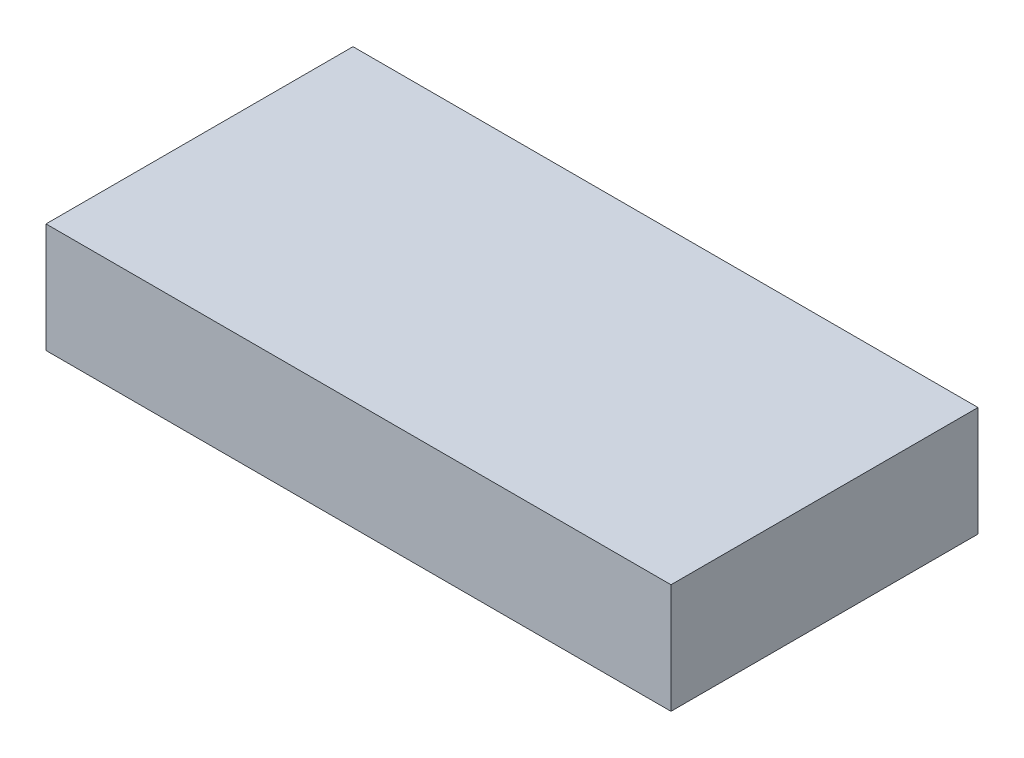
ISO-10303-21;
HEADER;
FILE_DESCRIPTION(('STEP AP214'),'2;1');
FILE_NAME('part.step','',(''),(''),'','','');
FILE_SCHEMA(('AUTOMOTIVE_DESIGN { 1 0 10303 214 1 1 1 1 }'));
ENDSEC;
DATA;
#1=APPLICATION_CONTEXT('core data for automotive mechanical design processes');
#2=APPLICATION_PROTOCOL_DEFINITION('international standard','automotive_design',2000,#1);
#3=PRODUCT_CONTEXT('',#1,'mechanical');
#4=PRODUCT('Part','Part','',(#3));
#5=PRODUCT_RELATED_PRODUCT_CATEGORY('part','',(#4));
#6=PRODUCT_DEFINITION_FORMATION('','',#4);
#7=PRODUCT_DEFINITION_CONTEXT('part definition',#1,'design');
#8=PRODUCT_DEFINITION('design','',#6,#7);
#9=PRODUCT_DEFINITION_SHAPE('','',#8);
#10=(LENGTH_UNIT() NAMED_UNIT(*) SI_UNIT(.MILLI.,.METRE.));
#11=(NAMED_UNIT(*) PLANE_ANGLE_UNIT() SI_UNIT($,.RADIAN.));
#12=(NAMED_UNIT(*) SI_UNIT($,.STERADIAN.) SOLID_ANGLE_UNIT());
#13=UNCERTAINTY_MEASURE_WITH_UNIT(LENGTH_MEASURE(1.E-05),#10,'distance_accuracy_value','');
#14=(GEOMETRIC_REPRESENTATION_CONTEXT(3) GLOBAL_UNCERTAINTY_ASSIGNED_CONTEXT((#13)) GLOBAL_UNIT_ASSIGNED_CONTEXT((#10,
#11,#12)) REPRESENTATION_CONTEXT('',''));
#15=CARTESIAN_POINT('',(0.,0.,0.));
#16=DIRECTION('',(0.,0.,1.));
#17=DIRECTION('',(1.,0.,0.));
#18=AXIS2_PLACEMENT_3D('',#15,#16,#17);
#19=CARTESIAN_POINT('',(28.5,10.,-14.));
#20=DIRECTION('',(-1.,0.,0.));
#21=DIRECTION('',(0.,0.,1.));
#22=AXIS2_PLACEMENT_3D('',#19,#20,#21);
#23=PLANE('',#22);
#24=DIRECTION('',(0.,0.,-1.));
#25=VECTOR('',#24,1.);
#26=CARTESIAN_POINT('',(28.5,0.,-14.));
#27=LINE('',#26,#25);
#28=CARTESIAN_POINT('',(28.5,0.,14.));
#29=VERTEX_POINT('',#28);
#30=CARTESIAN_POINT('',(28.5,0.,-14.));
#31=VERTEX_POINT('',#30);
#32=EDGE_CURVE('E98',#29,#31,#27,.T.);
#33=ORIENTED_EDGE('',*,*,#32,.T.);
#34=DIRECTION('',(0.,-1.,0.));
#35=VECTOR('',#34,1.);
#36=CARTESIAN_POINT('',(28.5,10.,-14.));
#37=LINE('',#36,#35);
#38=CARTESIAN_POINT('',(28.5,10.,-14.));
#39=VERTEX_POINT('',#38);
#40=EDGE_CURVE('E11',#39,#31,#37,.T.);
#41=ORIENTED_EDGE('',*,*,#40,.F.);
#42=DIRECTION('',(0.,0.,-1.));
#43=VECTOR('',#42,1.);
#44=CARTESIAN_POINT('',(28.5,10.,-14.));
#45=LINE('',#44,#43);
#46=CARTESIAN_POINT('',(28.5,10.,14.));
#47=VERTEX_POINT('',#46);
#48=EDGE_CURVE('E86',#47,#39,#45,.T.);
#49=ORIENTED_EDGE('',*,*,#48,.F.);
#50=DIRECTION('',(0.,-1.,0.));
#51=VECTOR('',#50,1.);
#52=CARTESIAN_POINT('',(28.5,10.,14.));
#53=LINE('',#52,#51);
#54=EDGE_CURVE('E94',#47,#29,#53,.T.);
#55=ORIENTED_EDGE('',*,*,#54,.T.);
#56=EDGE_LOOP('',(#33,#41,#49,#55));
#57=FACE_BOUND('',#56,.T.);
#58=ADVANCED_FACE('F35',(#57),#23,.F.);
#59=CARTESIAN_POINT('',(-28.5,10.,-14.));
#60=DIRECTION('',(0.,0.,1.));
#61=DIRECTION('',(1.,0.,0.));
#62=AXIS2_PLACEMENT_3D('',#59,#60,#61);
#63=PLANE('',#62);
#64=DIRECTION('',(-1.,0.,0.));
#65=VECTOR('',#64,1.);
#66=CARTESIAN_POINT('',(-28.5,0.,-14.));
#67=LINE('',#66,#65);
#68=CARTESIAN_POINT('',(-28.5,0.,-14.));
#69=VERTEX_POINT('',#68);
#70=EDGE_CURVE('E90',#31,#69,#67,.T.);
#71=ORIENTED_EDGE('',*,*,#70,.T.);
#72=DIRECTION('',(0.,-1.,0.));
#73=VECTOR('',#72,1.);
#74=CARTESIAN_POINT('',(-28.5,10.,-14.));
#75=LINE('',#74,#73);
#76=CARTESIAN_POINT('',(-28.5,10.,-14.));
#77=VERTEX_POINT('',#76);
#78=EDGE_CURVE('E43',#77,#69,#75,.T.);
#79=ORIENTED_EDGE('',*,*,#78,.F.);
#80=DIRECTION('',(-1.,0.,0.));
#81=VECTOR('',#80,1.);
#82=CARTESIAN_POINT('',(-28.5,10.,-14.));
#83=LINE('',#82,#81);
#84=EDGE_CURVE('E81',#39,#77,#83,.T.);
#85=ORIENTED_EDGE('',*,*,#84,.F.);
#86=ORIENTED_EDGE('',*,*,#40,.T.);
#87=EDGE_LOOP('',(#71,#79,#85,#86));
#88=FACE_BOUND('',#87,.T.);
#89=ADVANCED_FACE('F89',(#88),#63,.F.);
#90=CARTESIAN_POINT('',(-28.5,10.,-14.));
#91=DIRECTION('',(1.,0.,0.));
#92=DIRECTION('',(0.,0.,-1.));
#93=AXIS2_PLACEMENT_3D('',#90,#91,#92);
#94=PLANE('',#93);
#95=DIRECTION('',(0.,0.,1.));
#96=VECTOR('',#95,1.);
#97=CARTESIAN_POINT('',(-28.5,0.,-14.));
#98=LINE('',#97,#96);
#99=CARTESIAN_POINT('',(-28.5,0.,14.));
#100=VERTEX_POINT('',#99);
#101=EDGE_CURVE('E68',#69,#100,#98,.T.);
#102=ORIENTED_EDGE('',*,*,#101,.T.);
#103=DIRECTION('',(0.,-1.,0.));
#104=VECTOR('',#103,1.);
#105=CARTESIAN_POINT('',(-28.5,10.,14.));
#106=LINE('',#105,#104);
#107=CARTESIAN_POINT('',(-28.5,10.,14.));
#108=VERTEX_POINT('',#107);
#109=EDGE_CURVE('E91',#108,#100,#106,.T.);
#110=ORIENTED_EDGE('',*,*,#109,.F.);
#111=DIRECTION('',(0.,0.,1.));
#112=VECTOR('',#111,1.);
#113=CARTESIAN_POINT('',(-28.5,10.,-14.));
#114=LINE('',#113,#112);
#115=EDGE_CURVE('E84',#77,#108,#114,.T.);
#116=ORIENTED_EDGE('',*,*,#115,.F.);
#117=ORIENTED_EDGE('',*,*,#78,.T.);
#118=EDGE_LOOP('',(#102,#110,#116,#117));
#119=FACE_BOUND('',#118,.T.);
#120=ADVANCED_FACE('F92',(#119),#94,.F.);
#121=CARTESIAN_POINT('',(-28.5,10.,14.));
#122=DIRECTION('',(0.,0.,-1.));
#123=DIRECTION('',(-1.,0.,0.));
#124=AXIS2_PLACEMENT_3D('',#121,#122,#123);
#125=PLANE('',#124);
#126=DIRECTION('',(1.,0.,0.));
#127=VECTOR('',#126,1.);
#128=CARTESIAN_POINT('',(-28.5,0.,14.));
#129=LINE('',#128,#127);
#130=EDGE_CURVE('E74',#100,#29,#129,.T.);
#131=ORIENTED_EDGE('',*,*,#130,.T.);
#132=ORIENTED_EDGE('',*,*,#54,.F.);
#133=DIRECTION('',(1.,0.,0.));
#134=VECTOR('',#133,1.);
#135=CARTESIAN_POINT('',(-28.5,10.,14.));
#136=LINE('',#135,#134);
#137=EDGE_CURVE('E51',#108,#47,#136,.T.);
#138=ORIENTED_EDGE('',*,*,#137,.F.);
#139=ORIENTED_EDGE('',*,*,#109,.T.);
#140=EDGE_LOOP('',(#131,#132,#138,#139));
#141=FACE_BOUND('',#140,.T.);
#142=ADVANCED_FACE('F105',(#141),#125,.F.);
#143=CARTESIAN_POINT('',(0.,10.,0.));
#144=DIRECTION('',(0.,1.,0.));
#145=DIRECTION('',(0.,0.,1.));
#146=AXIS2_PLACEMENT_3D('',#143,#144,#145);
#147=PLANE('',#146);
#148=ORIENTED_EDGE('',*,*,#48,.T.);
#149=ORIENTED_EDGE('',*,*,#84,.T.);
#150=ORIENTED_EDGE('',*,*,#115,.T.);
#151=ORIENTED_EDGE('',*,*,#137,.T.);
#152=EDGE_LOOP('',(#148,#149,#150,#151));
#153=FACE_BOUND('',#152,.T.);
#154=ADVANCED_FACE('F82',(#153),#147,.T.);
#155=CARTESIAN_POINT('',(0.,0.,0.));
#156=DIRECTION('',(0.,1.,0.));
#157=DIRECTION('',(0.,0.,1.));
#158=AXIS2_PLACEMENT_3D('',#155,#156,#157);
#159=PLANE('',#158);
#160=ORIENTED_EDGE('',*,*,#32,.F.);
#161=ORIENTED_EDGE('',*,*,#130,.F.);
#162=ORIENTED_EDGE('',*,*,#101,.F.);
#163=ORIENTED_EDGE('',*,*,#70,.F.);
#164=EDGE_LOOP('',(#160,#161,#162,#163));
#165=FACE_BOUND('',#164,.T.);
#166=ADVANCED_FACE('F108',(#165),#159,.F.);
#167=CLOSED_SHELL('',(#58,#89,#120,#142,#154,#166));
#168=MANIFOLD_SOLID_BREP('B2',#167);
#169=ADVANCED_BREP_SHAPE_REPRESENTATION('',(#18,#168),#14);
#170=SHAPE_DEFINITION_REPRESENTATION(#9,#169);
ENDSEC;
END-ISO-10303-21;
